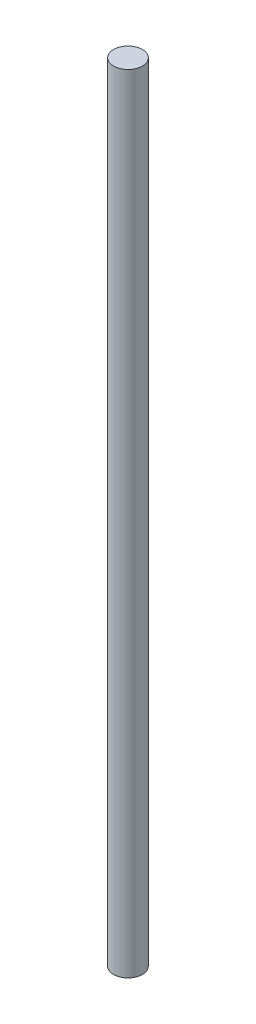
ISO-10303-21;
HEADER;
FILE_DESCRIPTION(('STEP AP214'),'2;1');
FILE_NAME('part.step','',(''),(''),'','','');
FILE_SCHEMA(('AUTOMOTIVE_DESIGN { 1 0 10303 214 1 1 1 1 }'));
ENDSEC;
DATA;
#1=APPLICATION_CONTEXT('core data for automotive mechanical design processes');
#2=APPLICATION_PROTOCOL_DEFINITION('international standard','automotive_design',2000,#1);
#3=PRODUCT_CONTEXT('',#1,'mechanical');
#4=PRODUCT('Part','Part','',(#3));
#5=PRODUCT_RELATED_PRODUCT_CATEGORY('part','',(#4));
#6=PRODUCT_DEFINITION_FORMATION('','',#4);
#7=PRODUCT_DEFINITION_CONTEXT('part definition',#1,'design');
#8=PRODUCT_DEFINITION('design','',#6,#7);
#9=PRODUCT_DEFINITION_SHAPE('','',#8);
#10=(LENGTH_UNIT() NAMED_UNIT(*) SI_UNIT(.MILLI.,.METRE.));
#11=(NAMED_UNIT(*) PLANE_ANGLE_UNIT() SI_UNIT($,.RADIAN.));
#12=(NAMED_UNIT(*) SI_UNIT($,.STERADIAN.) SOLID_ANGLE_UNIT());
#13=UNCERTAINTY_MEASURE_WITH_UNIT(LENGTH_MEASURE(1.E-05),#10,'distance_accuracy_value','');
#14=(GEOMETRIC_REPRESENTATION_CONTEXT(3) GLOBAL_UNCERTAINTY_ASSIGNED_CONTEXT((#13)) GLOBAL_UNIT_ASSIGNED_CONTEXT((#10,
#11,#12)) REPRESENTATION_CONTEXT('',''));
#15=CARTESIAN_POINT('',(0.,0.,0.));
#16=DIRECTION('',(0.,0.,1.));
#17=DIRECTION('',(1.,0.,0.));
#18=AXIS2_PLACEMENT_3D('',#15,#16,#17);
#19=CARTESIAN_POINT('',(0.,55.499,0.));
#20=DIRECTION('',(0.,-1.,0.));
#21=DIRECTION('',(0.,0.,-1.));
#22=AXIS2_PLACEMENT_3D('',#19,#20,#21);
#23=CYLINDRICAL_SURFACE('',#22,2.032);
#24=CARTESIAN_POINT('',(0.,55.499,0.));
#25=DIRECTION('',(0.,1.,0.));
#26=DIRECTION('',(0.,0.,1.));
#27=AXIS2_PLACEMENT_3D('',#24,#25,#26);
#28=CIRCLE('',#27,2.032);
#29=CARTESIAN_POINT('',(0.,55.499,2.032));
#30=VERTEX_POINT('',#29);
#31=EDGE_CURVE('E10',#30,#30,#28,.T.);
#32=ORIENTED_EDGE('',*,*,#31,.F.);
#33=EDGE_LOOP('',(#32));
#34=FACE_BOUND('',#33,.T.);
#35=CARTESIAN_POINT('',(0.,-55.499,0.));
#36=DIRECTION('',(0.,1.,0.));
#37=DIRECTION('',(0.,0.,1.));
#38=AXIS2_PLACEMENT_3D('',#35,#36,#37);
#39=CIRCLE('',#38,2.032);
#40=CARTESIAN_POINT('',(0.,-55.499,2.032));
#41=VERTEX_POINT('',#40);
#42=EDGE_CURVE('E36',#41,#41,#39,.T.);
#43=ORIENTED_EDGE('',*,*,#42,.T.);
#44=EDGE_LOOP('',(#43));
#45=FACE_BOUND('',#44,.T.);
#46=ADVANCED_FACE('F33',(#34,#45),#23,.T.);
#47=CARTESIAN_POINT('',(0.,55.499,0.));
#48=DIRECTION('',(0.,1.,0.));
#49=DIRECTION('',(0.,0.,1.));
#50=AXIS2_PLACEMENT_3D('',#47,#48,#49);
#51=PLANE('',#50);
#52=ORIENTED_EDGE('',*,*,#31,.T.);
#53=EDGE_LOOP('',(#52));
#54=FACE_BOUND('',#53,.T.);
#55=ADVANCED_FACE('F48',(#54),#51,.T.);
#56=CARTESIAN_POINT('',(0.,-55.499,0.));
#57=DIRECTION('',(0.,1.,0.));
#58=DIRECTION('',(0.,0.,1.));
#59=AXIS2_PLACEMENT_3D('',#56,#57,#58);
#60=PLANE('',#59);
#61=ORIENTED_EDGE('',*,*,#42,.F.);
#62=EDGE_LOOP('',(#61));
#63=FACE_BOUND('',#62,.T.);
#64=ADVANCED_FACE('F46',(#63),#60,.F.);
#65=CLOSED_SHELL('',(#46,#55,#64));
#66=MANIFOLD_SOLID_BREP('B2',#65);
#67=ADVANCED_BREP_SHAPE_REPRESENTATION('',(#18,#66),#14);
#68=SHAPE_DEFINITION_REPRESENTATION(#9,#67);
ENDSEC;
END-ISO-10303-21;
